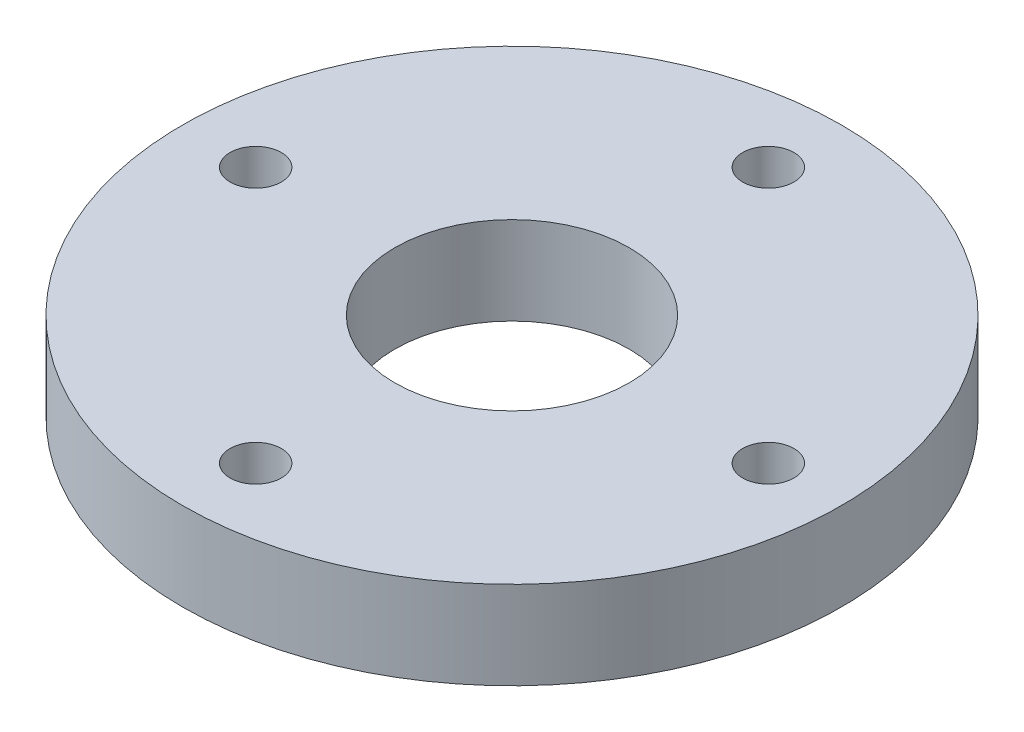
ISO-10303-21;
HEADER;
FILE_DESCRIPTION(('STEP AP214'),'2;1');
FILE_NAME('part.step','',(''),(''),'','','');
FILE_SCHEMA(('AUTOMOTIVE_DESIGN { 1 0 10303 214 1 1 1 1 }'));
ENDSEC;
DATA;
#1=APPLICATION_CONTEXT('core data for automotive mechanical design processes');
#2=APPLICATION_PROTOCOL_DEFINITION('international standard','automotive_design',2000,#1);
#3=PRODUCT_CONTEXT('',#1,'mechanical');
#4=PRODUCT('Part','Part','',(#3));
#5=PRODUCT_RELATED_PRODUCT_CATEGORY('part','',(#4));
#6=PRODUCT_DEFINITION_FORMATION('','',#4);
#7=PRODUCT_DEFINITION_CONTEXT('part definition',#1,'design');
#8=PRODUCT_DEFINITION('design','',#6,#7);
#9=PRODUCT_DEFINITION_SHAPE('','',#8);
#10=(LENGTH_UNIT() NAMED_UNIT(*) SI_UNIT(.MILLI.,.METRE.));
#11=(NAMED_UNIT(*) PLANE_ANGLE_UNIT() SI_UNIT($,.RADIAN.));
#12=(NAMED_UNIT(*) SI_UNIT($,.STERADIAN.) SOLID_ANGLE_UNIT());
#13=UNCERTAINTY_MEASURE_WITH_UNIT(LENGTH_MEASURE(1.E-05),#10,'distance_accuracy_value','');
#14=(GEOMETRIC_REPRESENTATION_CONTEXT(3) GLOBAL_UNCERTAINTY_ASSIGNED_CONTEXT((#13)) GLOBAL_UNIT_ASSIGNED_CONTEXT((#10,
#11,#12)) REPRESENTATION_CONTEXT('',''));
#15=CARTESIAN_POINT('',(0.,0.,0.));
#16=DIRECTION('',(0.,0.,1.));
#17=DIRECTION('',(1.,0.,0.));
#18=AXIS2_PLACEMENT_3D('',#15,#16,#17);
#19=CARTESIAN_POINT('',(0.,6.,0.));
#20=DIRECTION('',(0.,1.,0.));
#21=DIRECTION('',(0.,0.,1.));
#22=AXIS2_PLACEMENT_3D('',#19,#20,#21);
#23=PLANE('',#22);
#24=CARTESIAN_POINT('',(17.5,6.,-1.83302770289265E-13));
#25=DIRECTION('',(0.,1.,0.));
#26=DIRECTION('',(-1.,0.,0.));
#27=AXIS2_PLACEMENT_3D('',#24,#25,#26);
#28=CIRCLE('',#27,1.75);
#29=CARTESIAN_POINT('',(15.75,6.,-1.64972493260338E-13));
#30=VERTEX_POINT('',#29);
#31=EDGE_CURVE('E70',#30,#30,#28,.T.);
#32=ORIENTED_EDGE('',*,*,#31,.F.);
#33=EDGE_LOOP('',(#32));
#34=FACE_BOUND('',#33,.T.);
#35=CARTESIAN_POINT('',(0.,6.,17.5));
#36=DIRECTION('',(0.,1.,0.));
#37=DIRECTION('',(0.,0.,-1.));
#38=AXIS2_PLACEMENT_3D('',#35,#36,#37);
#39=CIRCLE('',#38,1.75);
#40=CARTESIAN_POINT('',(0.,6.,15.75));
#41=VERTEX_POINT('',#40);
#42=EDGE_CURVE('E64',#41,#41,#39,.T.);
#43=ORIENTED_EDGE('',*,*,#42,.F.);
#44=EDGE_LOOP('',(#43));
#45=FACE_BOUND('',#44,.T.);
#46=CARTESIAN_POINT('',(-17.5,6.,0.));
#47=DIRECTION('',(0.,1.,0.));
#48=DIRECTION('',(1.,0.,0.));
#49=AXIS2_PLACEMENT_3D('',#46,#47,#48);
#50=CIRCLE('',#49,1.75);
#51=CARTESIAN_POINT('',(-15.75,6.,0.));
#52=VERTEX_POINT('',#51);
#53=EDGE_CURVE('E58',#52,#52,#50,.T.);
#54=ORIENTED_EDGE('',*,*,#53,.F.);
#55=EDGE_LOOP('',(#54));
#56=FACE_BOUND('',#55,.T.);
#57=CARTESIAN_POINT('',(0.,6.,-17.5));
#58=DIRECTION('',(0.,1.,0.));
#59=DIRECTION('',(0.,0.,1.));
#60=AXIS2_PLACEMENT_3D('',#57,#58,#59);
#61=CIRCLE('',#60,1.75);
#62=CARTESIAN_POINT('',(0.,6.,-15.75));
#63=VERTEX_POINT('',#62);
#64=EDGE_CURVE('E52',#63,#63,#61,.T.);
#65=ORIENTED_EDGE('',*,*,#64,.F.);
#66=EDGE_LOOP('',(#65));
#67=FACE_BOUND('',#66,.T.);
#68=CARTESIAN_POINT('',(0.,6.,0.));
#69=DIRECTION('',(0.,1.,0.));
#70=DIRECTION('',(0.,0.,1.));
#71=AXIS2_PLACEMENT_3D('',#68,#69,#70);
#72=CIRCLE('',#71,22.5);
#73=CARTESIAN_POINT('',(0.,6.,22.5));
#74=VERTEX_POINT('',#73);
#75=EDGE_CURVE('E10',#74,#74,#72,.T.);
#76=ORIENTED_EDGE('',*,*,#75,.T.);
#77=EDGE_LOOP('',(#76));
#78=FACE_BOUND('',#77,.T.);
#79=CARTESIAN_POINT('',(0.,6.,0.));
#80=DIRECTION('',(0.,1.,0.));
#81=DIRECTION('',(0.,0.,1.));
#82=AXIS2_PLACEMENT_3D('',#79,#80,#81);
#83=CIRCLE('',#82,8.);
#84=CARTESIAN_POINT('',(0.,6.,8.));
#85=VERTEX_POINT('',#84);
#86=EDGE_CURVE('E44',#85,#85,#83,.T.);
#87=ORIENTED_EDGE('',*,*,#86,.F.);
#88=EDGE_LOOP('',(#87));
#89=FACE_BOUND('',#88,.T.);
#90=ADVANCED_FACE('F33',(#34,#45,#56,#67,#78,#89),#23,.T.);
#91=CARTESIAN_POINT('',(0.,0.,0.));
#92=DIRECTION('',(0.,1.,0.));
#93=DIRECTION('',(0.,0.,1.));
#94=AXIS2_PLACEMENT_3D('',#91,#92,#93);
#95=PLANE('',#94);
#96=CARTESIAN_POINT('',(-14.0059244811914,0.,3.75287615398675));
#97=DIRECTION('',(0.,-1.,0.));
#98=DIRECTION('',(0.866025403784443,0.,0.499999999999992));
#99=AXIS2_PLACEMENT_3D('',#96,#97,#98);
#100=CIRCLE('',#99,0.750000000000002);
#101=CARTESIAN_POINT('',(-13.3564054283531,0.,4.12787615398675));
#102=VERTEX_POINT('',#101);
#103=EDGE_CURVE('E88',#102,#102,#100,.T.);
#104=ORIENTED_EDGE('',*,*,#103,.F.);
#105=EDGE_LOOP('',(#104));
#106=FACE_BOUND('',#105,.T.);
#107=CARTESIAN_POINT('',(3.75287615398641,0.,-14.0059244811915));
#108=DIRECTION('',(0.,-1.,0.));
#109=DIRECTION('',(-0.866025403784436,0.,0.500000000000004));
#110=AXIS2_PLACEMENT_3D('',#107,#108,#109);
#111=CIRCLE('',#110,0.750000000000002);
#112=CARTESIAN_POINT('',(3.10335710114809,0.,-13.6309244811915));
#113=VERTEX_POINT('',#112);
#114=EDGE_CURVE('E82',#113,#113,#111,.T.);
#115=ORIENTED_EDGE('',*,*,#114,.F.);
#116=EDGE_LOOP('',(#115));
#117=FACE_BOUND('',#116,.T.);
#118=CARTESIAN_POINT('',(10.253048327205,0.,10.2530483272049));
#119=DIRECTION('',(0.,-1.,0.));
#120=DIRECTION('',(0.,0.,-1.));
#121=AXIS2_PLACEMENT_3D('',#118,#119,#120);
#122=CIRCLE('',#121,0.750000000000002);
#123=CARTESIAN_POINT('',(10.253048327205,0.,9.50304832720489));
#124=VERTEX_POINT('',#123);
#125=EDGE_CURVE('E76',#124,#124,#122,.T.);
#126=ORIENTED_EDGE('',*,*,#125,.F.);
#127=EDGE_LOOP('',(#126));
#128=FACE_BOUND('',#127,.T.);
#129=CARTESIAN_POINT('',(17.5,0.,-1.83302770289265E-13));
#130=DIRECTION('',(0.,1.,0.));
#131=DIRECTION('',(-1.,0.,0.));
#132=AXIS2_PLACEMENT_3D('',#129,#130,#131);
#133=CIRCLE('',#132,1.75);
#134=CARTESIAN_POINT('',(15.75,0.,-1.64972493260338E-13));
#135=VERTEX_POINT('',#134);
#136=EDGE_CURVE('E67',#135,#135,#133,.T.);
#137=ORIENTED_EDGE('',*,*,#136,.T.);
#138=EDGE_LOOP('',(#137));
#139=FACE_BOUND('',#138,.T.);
#140=CARTESIAN_POINT('',(0.,0.,17.5));
#141=DIRECTION('',(0.,1.,0.));
#142=DIRECTION('',(0.,0.,-1.));
#143=AXIS2_PLACEMENT_3D('',#140,#141,#142);
#144=CIRCLE('',#143,1.75);
#145=CARTESIAN_POINT('',(0.,0.,15.75));
#146=VERTEX_POINT('',#145);
#147=EDGE_CURVE('E61',#146,#146,#144,.T.);
#148=ORIENTED_EDGE('',*,*,#147,.T.);
#149=EDGE_LOOP('',(#148));
#150=FACE_BOUND('',#149,.T.);
#151=CARTESIAN_POINT('',(-17.5,0.,0.));
#152=DIRECTION('',(0.,1.,0.));
#153=DIRECTION('',(1.,0.,0.));
#154=AXIS2_PLACEMENT_3D('',#151,#152,#153);
#155=CIRCLE('',#154,1.75);
#156=CARTESIAN_POINT('',(-15.75,0.,0.));
#157=VERTEX_POINT('',#156);
#158=EDGE_CURVE('E55',#157,#157,#155,.T.);
#159=ORIENTED_EDGE('',*,*,#158,.T.);
#160=EDGE_LOOP('',(#159));
#161=FACE_BOUND('',#160,.T.);
#162=CARTESIAN_POINT('',(0.,0.,-17.5));
#163=DIRECTION('',(0.,1.,0.));
#164=DIRECTION('',(0.,0.,1.));
#165=AXIS2_PLACEMENT_3D('',#162,#163,#164);
#166=CIRCLE('',#165,1.75);
#167=CARTESIAN_POINT('',(0.,0.,-15.75));
#168=VERTEX_POINT('',#167);
#169=EDGE_CURVE('E49',#168,#168,#166,.T.);
#170=ORIENTED_EDGE('',*,*,#169,.T.);
#171=EDGE_LOOP('',(#170));
#172=FACE_BOUND('',#171,.T.);
#173=CARTESIAN_POINT('',(0.,0.,0.));
#174=DIRECTION('',(0.,1.,0.));
#175=DIRECTION('',(0.,0.,1.));
#176=AXIS2_PLACEMENT_3D('',#173,#174,#175);
#177=CIRCLE('',#176,22.5);
#178=CARTESIAN_POINT('',(0.,0.,22.5));
#179=VERTEX_POINT('',#178);
#180=EDGE_CURVE('E37',#179,#179,#177,.T.);
#181=ORIENTED_EDGE('',*,*,#180,.F.);
#182=EDGE_LOOP('',(#181));
#183=FACE_BOUND('',#182,.T.);
#184=CARTESIAN_POINT('',(0.,0.,0.));
#185=DIRECTION('',(0.,1.,0.));
#186=DIRECTION('',(0.,0.,1.));
#187=AXIS2_PLACEMENT_3D('',#184,#185,#186);
#188=CIRCLE('',#187,8.);
#189=CARTESIAN_POINT('',(0.,0.,8.));
#190=VERTEX_POINT('',#189);
#191=EDGE_CURVE('E46',#190,#190,#188,.T.);
#192=ORIENTED_EDGE('',*,*,#191,.T.);
#193=EDGE_LOOP('',(#192));
#194=FACE_BOUND('',#193,.T.);
#195=ADVANCED_FACE('F103',(#106,#117,#128,#139,#150,#161,#172,#183,#194),#95,.F.);
#196=CARTESIAN_POINT('',(0.,6.,0.));
#197=DIRECTION('',(0.,-1.,0.));
#198=DIRECTION('',(0.,0.,-1.));
#199=AXIS2_PLACEMENT_3D('',#196,#197,#198);
#200=CYLINDRICAL_SURFACE('',#199,22.5);
#201=ORIENTED_EDGE('',*,*,#75,.F.);
#202=EDGE_LOOP('',(#201));
#203=FACE_BOUND('',#202,.T.);
#204=ORIENTED_EDGE('',*,*,#180,.T.);
#205=EDGE_LOOP('',(#204));
#206=FACE_BOUND('',#205,.T.);
#207=ADVANCED_FACE('F35',(#203,#206),#200,.T.);
#208=CARTESIAN_POINT('',(0.,6.,0.));
#209=DIRECTION('',(0.,-1.,0.));
#210=DIRECTION('',(0.,0.,-1.));
#211=AXIS2_PLACEMENT_3D('',#208,#209,#210);
#212=CYLINDRICAL_SURFACE('',#211,8.);
#213=ORIENTED_EDGE('',*,*,#86,.T.);
#214=EDGE_LOOP('',(#213));
#215=FACE_BOUND('',#214,.T.);
#216=ORIENTED_EDGE('',*,*,#191,.F.);
#217=EDGE_LOOP('',(#216));
#218=FACE_BOUND('',#217,.T.);
#219=ADVANCED_FACE('F122',(#215,#218),#212,.F.);
#220=CARTESIAN_POINT('',(0.,0.,-17.5));
#221=DIRECTION('',(0.,1.,0.));
#222=DIRECTION('',(0.,0.,1.));
#223=AXIS2_PLACEMENT_3D('',#220,#221,#222);
#224=CYLINDRICAL_SURFACE('',#223,1.75);
#225=ORIENTED_EDGE('',*,*,#169,.F.);
#226=EDGE_LOOP('',(#225));
#227=FACE_BOUND('',#226,.T.);
#228=ORIENTED_EDGE('',*,*,#64,.T.);
#229=EDGE_LOOP('',(#228));
#230=FACE_BOUND('',#229,.T.);
#231=ADVANCED_FACE('F124',(#227,#230),#224,.F.);
#232=CARTESIAN_POINT('',(-17.5,0.,0.));
#233=DIRECTION('',(0.,1.,0.));
#234=DIRECTION('',(0.,0.,1.));
#235=AXIS2_PLACEMENT_3D('',#232,#233,#234);
#236=CYLINDRICAL_SURFACE('',#235,1.75);
#237=ORIENTED_EDGE('',*,*,#158,.F.);
#238=EDGE_LOOP('',(#237));
#239=FACE_BOUND('',#238,.T.);
#240=ORIENTED_EDGE('',*,*,#53,.T.);
#241=EDGE_LOOP('',(#240));
#242=FACE_BOUND('',#241,.T.);
#243=ADVANCED_FACE('F131',(#239,#242),#236,.F.);
#244=CARTESIAN_POINT('',(0.,0.,17.5));
#245=DIRECTION('',(0.,1.,0.));
#246=DIRECTION('',(0.,0.,1.));
#247=AXIS2_PLACEMENT_3D('',#244,#245,#246);
#248=CYLINDRICAL_SURFACE('',#247,1.75);
#249=ORIENTED_EDGE('',*,*,#147,.F.);
#250=EDGE_LOOP('',(#249));
#251=FACE_BOUND('',#250,.T.);
#252=ORIENTED_EDGE('',*,*,#42,.T.);
#253=EDGE_LOOP('',(#252));
#254=FACE_BOUND('',#253,.T.);
#255=ADVANCED_FACE('F152',(#251,#254),#248,.F.);
#256=CARTESIAN_POINT('',(17.5,0.,-1.83302770289265E-13));
#257=DIRECTION('',(0.,1.,0.));
#258=DIRECTION('',(0.,0.,1.));
#259=AXIS2_PLACEMENT_3D('',#256,#257,#258);
#260=CYLINDRICAL_SURFACE('',#259,1.75);
#261=ORIENTED_EDGE('',*,*,#136,.F.);
#262=EDGE_LOOP('',(#261));
#263=FACE_BOUND('',#262,.T.);
#264=ORIENTED_EDGE('',*,*,#31,.T.);
#265=EDGE_LOOP('',(#264));
#266=FACE_BOUND('',#265,.T.);
#267=ADVANCED_FACE('F158',(#263,#266),#260,.F.);
#268=CARTESIAN_POINT('',(10.253048327205,5.,10.2530483272049));
#269=DIRECTION('',(0.,-1.,0.));
#270=DIRECTION('',(0.,0.,-1.));
#271=AXIS2_PLACEMENT_3D('',#268,#269,#270);
#272=CYLINDRICAL_SURFACE('',#271,0.750000000000002);
#273=CARTESIAN_POINT('',(10.253048327205,5.,10.2530483272049));
#274=DIRECTION('',(0.,-1.,0.));
#275=DIRECTION('',(0.,0.,-1.));
#276=AXIS2_PLACEMENT_3D('',#273,#274,#275);
#277=CIRCLE('',#276,0.750000000000002);
#278=CARTESIAN_POINT('',(10.253048327205,5.,9.50304832720489));
#279=VERTEX_POINT('',#278);
#280=EDGE_CURVE('E73',#279,#279,#277,.T.);
#281=ORIENTED_EDGE('',*,*,#280,.F.);
#282=EDGE_LOOP('',(#281));
#283=FACE_BOUND('',#282,.T.);
#284=ORIENTED_EDGE('',*,*,#125,.T.);
#285=EDGE_LOOP('',(#284));
#286=FACE_BOUND('',#285,.T.);
#287=ADVANCED_FACE('F164',(#283,#286),#272,.F.);
#288=CARTESIAN_POINT('',(10.253048327205,5.,10.2530483272049));
#289=DIRECTION('',(0.,-1.,0.));
#290=DIRECTION('',(0.,0.,-1.));
#291=AXIS2_PLACEMENT_3D('',#288,#289,#290);
#292=PLANE('',#291);
#293=ORIENTED_EDGE('',*,*,#280,.T.);
#294=EDGE_LOOP('',(#293));
#295=FACE_BOUND('',#294,.T.);
#296=ADVANCED_FACE('F168',(#295),#292,.T.);
#297=CARTESIAN_POINT('',(3.75287615398641,5.,-14.0059244811915));
#298=DIRECTION('',(0.,-1.,0.));
#299=DIRECTION('',(0.,0.,-1.));
#300=AXIS2_PLACEMENT_3D('',#297,#298,#299);
#301=CYLINDRICAL_SURFACE('',#300,0.750000000000002);
#302=CARTESIAN_POINT('',(3.75287615398641,5.,-14.0059244811915));
#303=DIRECTION('',(0.,-1.,0.));
#304=DIRECTION('',(-0.866025403784436,0.,0.500000000000004));
#305=AXIS2_PLACEMENT_3D('',#302,#303,#304);
#306=CIRCLE('',#305,0.750000000000002);
#307=CARTESIAN_POINT('',(3.10335710114809,5.,-13.6309244811915));
#308=VERTEX_POINT('',#307);
#309=EDGE_CURVE('E79',#308,#308,#306,.T.);
#310=ORIENTED_EDGE('',*,*,#309,.F.);
#311=EDGE_LOOP('',(#310));
#312=FACE_BOUND('',#311,.T.);
#313=ORIENTED_EDGE('',*,*,#114,.T.);
#314=EDGE_LOOP('',(#313));
#315=FACE_BOUND('',#314,.T.);
#316=ADVANCED_FACE('F172',(#312,#315),#301,.F.);
#317=CARTESIAN_POINT('',(3.75287615398641,5.,-14.0059244811915));
#318=DIRECTION('',(0.,-1.,0.));
#319=DIRECTION('',(-0.866025403784436,0.,0.500000000000004));
#320=AXIS2_PLACEMENT_3D('',#317,#318,#319);
#321=PLANE('',#320);
#322=ORIENTED_EDGE('',*,*,#309,.T.);
#323=EDGE_LOOP('',(#322));
#324=FACE_BOUND('',#323,.T.);
#325=ADVANCED_FACE('F99',(#324),#321,.T.);
#326=CARTESIAN_POINT('',(-14.0059244811914,5.,3.75287615398675));
#327=DIRECTION('',(0.,-1.,0.));
#328=DIRECTION('',(0.,0.,-1.));
#329=AXIS2_PLACEMENT_3D('',#326,#327,#328);
#330=CYLINDRICAL_SURFACE('',#329,0.750000000000002);
#331=CARTESIAN_POINT('',(-14.0059244811914,5.,3.75287615398675));
#332=DIRECTION('',(0.,-1.,0.));
#333=DIRECTION('',(0.866025403784443,0.,0.499999999999992));
#334=AXIS2_PLACEMENT_3D('',#331,#332,#333);
#335=CIRCLE('',#334,0.750000000000002);
#336=CARTESIAN_POINT('',(-13.3564054283531,5.,4.12787615398675));
#337=VERTEX_POINT('',#336);
#338=EDGE_CURVE('E85',#337,#337,#335,.T.);
#339=ORIENTED_EDGE('',*,*,#338,.F.);
#340=EDGE_LOOP('',(#339));
#341=FACE_BOUND('',#340,.T.);
#342=ORIENTED_EDGE('',*,*,#103,.T.);
#343=EDGE_LOOP('',(#342));
#344=FACE_BOUND('',#343,.T.);
#345=ADVANCED_FACE('F96',(#341,#344),#330,.F.);
#346=CARTESIAN_POINT('',(-14.0059244811914,5.,3.75287615398675));
#347=DIRECTION('',(0.,-1.,0.));
#348=DIRECTION('',(0.866025403784443,0.,0.499999999999992));
#349=AXIS2_PLACEMENT_3D('',#346,#347,#348);
#350=PLANE('',#349);
#351=ORIENTED_EDGE('',*,*,#338,.T.);
#352=EDGE_LOOP('',(#351));
#353=FACE_BOUND('',#352,.T.);
#354=ADVANCED_FACE('F94',(#353),#350,.T.);
#355=CLOSED_SHELL('',(#90,#195,#207,#219,#231,#243,#255,#267,#287,#296,#316,#325,#345,#354));
#356=MANIFOLD_SOLID_BREP('B2',#355);
#357=ADVANCED_BREP_SHAPE_REPRESENTATION('',(#18,#356),#14);
#358=SHAPE_DEFINITION_REPRESENTATION(#9,#357);
ENDSEC;
END-ISO-10303-21;
